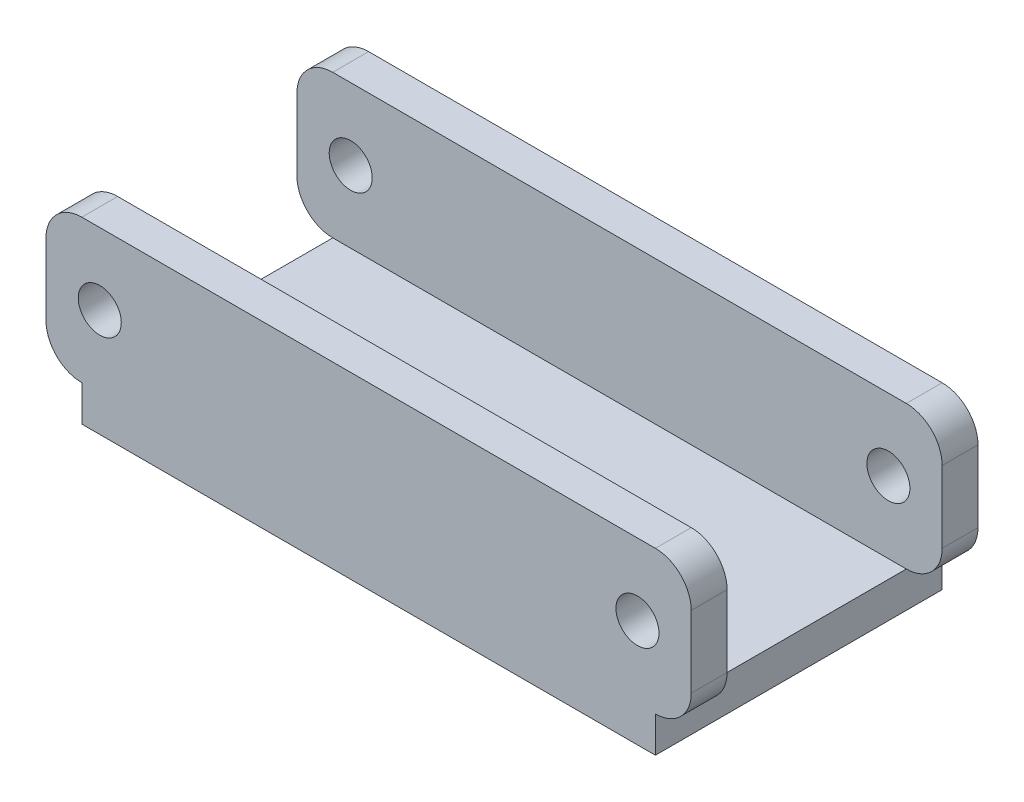
ISO-10303-21;
HEADER;
FILE_DESCRIPTION(('STEP AP214'),'2;1');
FILE_NAME('part.step','',(''),(''),'','','');
FILE_SCHEMA(('AUTOMOTIVE_DESIGN { 1 0 10303 214 1 1 1 1 }'));
ENDSEC;
DATA;
#1=APPLICATION_CONTEXT('core data for automotive mechanical design processes');
#2=APPLICATION_PROTOCOL_DEFINITION('international standard','automotive_design',2000,#1);
#3=PRODUCT_CONTEXT('',#1,'mechanical');
#4=PRODUCT('Part','Part','',(#3));
#5=PRODUCT_RELATED_PRODUCT_CATEGORY('part','',(#4));
#6=PRODUCT_DEFINITION_FORMATION('','',#4);
#7=PRODUCT_DEFINITION_CONTEXT('part definition',#1,'design');
#8=PRODUCT_DEFINITION('design','',#6,#7);
#9=PRODUCT_DEFINITION_SHAPE('','',#8);
#10=(LENGTH_UNIT() NAMED_UNIT(*) SI_UNIT(.MILLI.,.METRE.));
#11=(NAMED_UNIT(*) PLANE_ANGLE_UNIT() SI_UNIT($,.RADIAN.));
#12=(NAMED_UNIT(*) SI_UNIT($,.STERADIAN.) SOLID_ANGLE_UNIT());
#13=UNCERTAINTY_MEASURE_WITH_UNIT(LENGTH_MEASURE(1.E-05),#10,'distance_accuracy_value','');
#14=(GEOMETRIC_REPRESENTATION_CONTEXT(3) GLOBAL_UNCERTAINTY_ASSIGNED_CONTEXT((#13)) GLOBAL_UNIT_ASSIGNED_CONTEXT((#10,
#11,#12)) REPRESENTATION_CONTEXT('',''));
#15=CARTESIAN_POINT('',(0.,0.,0.));
#16=DIRECTION('',(0.,0.,1.));
#17=DIRECTION('',(1.,0.,0.));
#18=AXIS2_PLACEMENT_3D('',#15,#16,#17);
#19=CARTESIAN_POINT('',(0.,-100.,0.));
#20=DIRECTION('',(0.,-1.,0.));
#21=DIRECTION('',(0.,0.,-1.));
#22=AXIS2_PLACEMENT_3D('',#19,#20,#21);
#23=PLANE('',#22);
#24=DIRECTION('',(-1.,0.,0.));
#25=VECTOR('',#24,1.);
#26=CARTESIAN_POINT('',(-450.,-100.,50.));
#27=LINE('',#26,#25);
#28=CARTESIAN_POINT('',(400.,-100.,50.0000000000001));
#29=VERTEX_POINT('',#28);
#30=CARTESIAN_POINT('',(-400.,-100.,50.));
#31=VERTEX_POINT('',#30);
#32=EDGE_CURVE('E188',#29,#31,#27,.T.);
#33=ORIENTED_EDGE('',*,*,#32,.T.);
#34=DIRECTION('',(0.,0.,-1.));
#35=VECTOR('',#34,1.);
#36=CARTESIAN_POINT('',(-400.,-100.,400.));
#37=LINE('',#36,#35);
#38=CARTESIAN_POINT('',(-400.,-100.,350.));
#39=VERTEX_POINT('',#38);
#40=EDGE_CURVE('E216',#39,#31,#37,.T.);
#41=ORIENTED_EDGE('',*,*,#40,.F.);
#42=DIRECTION('',(1.,0.,0.));
#43=VECTOR('',#42,1.);
#44=CARTESIAN_POINT('',(-450.,-100.,350.));
#45=LINE('',#44,#43);
#46=CARTESIAN_POINT('',(400.,-100.,350.));
#47=VERTEX_POINT('',#46);
#48=EDGE_CURVE('E259',#39,#47,#45,.T.);
#49=ORIENTED_EDGE('',*,*,#48,.T.);
#50=DIRECTION('',(0.,0.,1.));
#51=VECTOR('',#50,1.);
#52=CARTESIAN_POINT('',(400.,-100.,400.));
#53=LINE('',#52,#51);
#54=EDGE_CURVE('E238',#29,#47,#53,.T.);
#55=ORIENTED_EDGE('',*,*,#54,.F.);
#56=EDGE_LOOP('',(#33,#41,#49,#55));
#57=FACE_BOUND('',#56,.T.);
#58=ADVANCED_FACE('F47',(#57),#23,.F.);
#59=CARTESIAN_POINT('',(450.,-100.,400.));
#60=DIRECTION('',(-1.,0.,0.));
#61=DIRECTION('',(0.,0.,1.));
#62=AXIS2_PLACEMENT_3D('',#59,#60,#61);
#63=PLANE('',#62);
#64=DIRECTION('',(0.,1.,0.));
#65=VECTOR('',#64,1.);
#66=CARTESIAN_POINT('',(450.,-100.,400.));
#67=LINE('',#66,#65);
#68=CARTESIAN_POINT('',(450.,-50.,400.));
#69=VERTEX_POINT('',#68);
#70=CARTESIAN_POINT('',(450.,50.,400.));
#71=VERTEX_POINT('',#70);
#72=EDGE_CURVE('E262',#69,#71,#67,.T.);
#73=ORIENTED_EDGE('',*,*,#72,.F.);
#74=DIRECTION('',(0.,0.,-1.));
#75=VECTOR('',#74,1.);
#76=CARTESIAN_POINT('',(450.,-50.,400.));
#77=LINE('',#76,#75);
#78=CARTESIAN_POINT('',(450.,-50.,350.));
#79=VERTEX_POINT('',#78);
#80=EDGE_CURVE('E11',#69,#79,#77,.T.);
#81=ORIENTED_EDGE('',*,*,#80,.T.);
#82=DIRECTION('',(0.,1.,0.));
#83=VECTOR('',#82,1.);
#84=CARTESIAN_POINT('',(450.,-100.,350.));
#85=LINE('',#84,#83);
#86=CARTESIAN_POINT('',(450.,50.,350.));
#87=VERTEX_POINT('',#86);
#88=EDGE_CURVE('E272',#79,#87,#85,.T.);
#89=ORIENTED_EDGE('',*,*,#88,.T.);
#90=DIRECTION('',(0.,0.,-1.));
#91=VECTOR('',#90,1.);
#92=CARTESIAN_POINT('',(450.,50.,400.));
#93=LINE('',#92,#91);
#94=EDGE_CURVE('E56',#87,#71,#93,.F.);
#95=ORIENTED_EDGE('',*,*,#94,.T.);
#96=EDGE_LOOP('',(#73,#81,#89,#95));
#97=FACE_BOUND('',#96,.T.);
#98=ADVANCED_FACE('F335',(#97),#63,.F.);
#99=CARTESIAN_POINT('',(-450.,100.,400.));
#100=DIRECTION('',(0.,-1.,0.));
#101=DIRECTION('',(0.,0.,-1.));
#102=AXIS2_PLACEMENT_3D('',#99,#100,#101);
#103=PLANE('',#102);
#104=DIRECTION('',(1.,0.,0.));
#105=VECTOR('',#104,1.);
#106=CARTESIAN_POINT('',(-848.527394625038,100.,350.));
#107=LINE('',#106,#105);
#108=CARTESIAN_POINT('',(-400.,100.,350.));
#109=VERTEX_POINT('',#108);
#110=CARTESIAN_POINT('',(400.,100.,350.));
#111=VERTEX_POINT('',#110);
#112=EDGE_CURVE('E267',#109,#111,#107,.T.);
#113=ORIENTED_EDGE('',*,*,#112,.F.);
#114=DIRECTION('',(0.,0.,-1.));
#115=VECTOR('',#114,1.);
#116=CARTESIAN_POINT('',(-400.,100.,400.));
#117=LINE('',#116,#115);
#118=CARTESIAN_POINT('',(-400.,100.,400.));
#119=VERTEX_POINT('',#118);
#120=EDGE_CURVE('E72',#109,#119,#117,.F.);
#121=ORIENTED_EDGE('',*,*,#120,.T.);
#122=DIRECTION('',(-1.,0.,0.));
#123=VECTOR('',#122,1.);
#124=CARTESIAN_POINT('',(-450.,100.,400.));
#125=LINE('',#124,#123);
#126=CARTESIAN_POINT('',(400.,100.,400.));
#127=VERTEX_POINT('',#126);
#128=EDGE_CURVE('E268',#127,#119,#125,.T.);
#129=ORIENTED_EDGE('',*,*,#128,.F.);
#130=DIRECTION('',(0.,0.,-1.));
#131=VECTOR('',#130,1.);
#132=CARTESIAN_POINT('',(400.,100.,400.));
#133=LINE('',#132,#131);
#134=EDGE_CURVE('E307',#127,#111,#133,.T.);
#135=ORIENTED_EDGE('',*,*,#134,.T.);
#136=EDGE_LOOP('',(#113,#121,#129,#135));
#137=FACE_BOUND('',#136,.T.);
#138=ADVANCED_FACE('F342',(#137),#103,.F.);
#139=CARTESIAN_POINT('',(-450.,-100.,400.));
#140=DIRECTION('',(1.,0.,0.));
#141=DIRECTION('',(0.,0.,-1.));
#142=AXIS2_PLACEMENT_3D('',#139,#140,#141);
#143=PLANE('',#142);
#144=DIRECTION('',(0.,-1.,0.));
#145=VECTOR('',#144,1.);
#146=CARTESIAN_POINT('',(-450.,-100.,350.));
#147=LINE('',#146,#145);
#148=CARTESIAN_POINT('',(-450.,50.,350.));
#149=VERTEX_POINT('',#148);
#150=CARTESIAN_POINT('',(-450.,-50.,350.));
#151=VERTEX_POINT('',#150);
#152=EDGE_CURVE('E263',#149,#151,#147,.T.);
#153=ORIENTED_EDGE('',*,*,#152,.T.);
#154=DIRECTION('',(0.,0.,-1.));
#155=VECTOR('',#154,1.);
#156=CARTESIAN_POINT('',(-450.,-50.,400.));
#157=LINE('',#156,#155);
#158=CARTESIAN_POINT('',(-450.,-50.,400.));
#159=VERTEX_POINT('',#158);
#160=EDGE_CURVE('E297',#151,#159,#157,.F.);
#161=ORIENTED_EDGE('',*,*,#160,.T.);
#162=DIRECTION('',(0.,-1.,0.));
#163=VECTOR('',#162,1.);
#164=CARTESIAN_POINT('',(-450.,-100.,400.));
#165=LINE('',#164,#163);
#166=CARTESIAN_POINT('',(-450.,50.,400.));
#167=VERTEX_POINT('',#166);
#168=EDGE_CURVE('E264',#167,#159,#165,.T.);
#169=ORIENTED_EDGE('',*,*,#168,.F.);
#170=DIRECTION('',(0.,0.,-1.));
#171=VECTOR('',#170,1.);
#172=CARTESIAN_POINT('',(-450.,50.,400.));
#173=LINE('',#172,#171);
#174=EDGE_CURVE('E294',#167,#149,#173,.T.);
#175=ORIENTED_EDGE('',*,*,#174,.T.);
#176=EDGE_LOOP('',(#153,#161,#169,#175));
#177=FACE_BOUND('',#176,.T.);
#178=ADVANCED_FACE('F580',(#177),#143,.F.);
#179=CARTESIAN_POINT('',(0.,0.,400.));
#180=DIRECTION('',(0.,0.,-1.));
#181=DIRECTION('',(-1.,0.,0.));
#182=AXIS2_PLACEMENT_3D('',#179,#180,#181);
#183=PLANE('',#182);
#184=CARTESIAN_POINT('',(-375.,0.,400.));
#185=DIRECTION('',(0.,0.,1.));
#186=DIRECTION('',(1.,0.,0.));
#187=AXIS2_PLACEMENT_3D('',#184,#185,#186);
#188=CIRCLE('',#187,30.);
#189=CARTESIAN_POINT('',(-345.,0.,400.));
#190=VERTEX_POINT('',#189);
#191=EDGE_CURVE('E253',#190,#190,#188,.T.);
#192=ORIENTED_EDGE('',*,*,#191,.F.);
#193=EDGE_LOOP('',(#192));
#194=FACE_BOUND('',#193,.T.);
#195=CARTESIAN_POINT('',(375.,0.,400.));
#196=DIRECTION('',(0.,0.,1.));
#197=DIRECTION('',(1.,0.,0.));
#198=AXIS2_PLACEMENT_3D('',#195,#196,#197);
#199=CIRCLE('',#198,30.);
#200=CARTESIAN_POINT('',(405.,0.,400.));
#201=VERTEX_POINT('',#200);
#202=EDGE_CURVE('E252',#201,#201,#199,.T.);
#203=ORIENTED_EDGE('',*,*,#202,.F.);
#204=EDGE_LOOP('',(#203));
#205=FACE_BOUND('',#204,.T.);
#206=ORIENTED_EDGE('',*,*,#168,.T.);
#207=CARTESIAN_POINT('',(-400.,-50.,400.));
#208=DIRECTION('',(0.,0.,-1.));
#209=DIRECTION('',(-1.,0.,0.));
#210=AXIS2_PLACEMENT_3D('',#207,#208,#209);
#211=CIRCLE('',#210,50.);
#212=CARTESIAN_POINT('',(-400.,-100.,400.));
#213=VERTEX_POINT('',#212);
#214=EDGE_CURVE('E305',#159,#213,#211,.F.);
#215=ORIENTED_EDGE('',*,*,#214,.T.);
#216=DIRECTION('',(0.,1.,0.));
#217=VECTOR('',#216,1.);
#218=CARTESIAN_POINT('',(-400.,-150.,400.));
#219=LINE('',#218,#217);
#220=CARTESIAN_POINT('',(-400.,-150.,400.));
#221=VERTEX_POINT('',#220);
#222=EDGE_CURVE('E235',#221,#213,#219,.T.);
#223=ORIENTED_EDGE('',*,*,#222,.F.);
#224=DIRECTION('',(-1.,0.,0.));
#225=VECTOR('',#224,1.);
#226=CARTESIAN_POINT('',(-400.,-150.,400.));
#227=LINE('',#226,#225);
#228=CARTESIAN_POINT('',(400.,-150.,400.));
#229=VERTEX_POINT('',#228);
#230=EDGE_CURVE('E233',#229,#221,#227,.T.);
#231=ORIENTED_EDGE('',*,*,#230,.F.);
#232=DIRECTION('',(0.,1.,0.));
#233=VECTOR('',#232,1.);
#234=CARTESIAN_POINT('',(400.,-150.,400.));
#235=LINE('',#234,#233);
#236=CARTESIAN_POINT('',(400.,-100.,400.));
#237=VERTEX_POINT('',#236);
#238=EDGE_CURVE('E243',#229,#237,#235,.T.);
#239=ORIENTED_EDGE('',*,*,#238,.T.);
#240=CARTESIAN_POINT('',(400.,-50.,400.));
#241=DIRECTION('',(0.,0.,-1.));
#242=DIRECTION('',(-1.,0.,0.));
#243=AXIS2_PLACEMENT_3D('',#240,#241,#242);
#244=CIRCLE('',#243,50.);
#245=EDGE_CURVE('E301',#237,#69,#244,.F.);
#246=ORIENTED_EDGE('',*,*,#245,.T.);
#247=ORIENTED_EDGE('',*,*,#72,.T.);
#248=CARTESIAN_POINT('',(400.,50.,400.));
#249=DIRECTION('',(0.,0.,-1.));
#250=DIRECTION('',(-1.,0.,0.));
#251=AXIS2_PLACEMENT_3D('',#248,#249,#250);
#252=CIRCLE('',#251,50.);
#253=EDGE_CURVE('E299',#71,#127,#252,.F.);
#254=ORIENTED_EDGE('',*,*,#253,.T.);
#255=ORIENTED_EDGE('',*,*,#128,.T.);
#256=CARTESIAN_POINT('',(-400.,50.,400.));
#257=DIRECTION('',(0.,0.,-1.));
#258=DIRECTION('',(-1.,0.,0.));
#259=AXIS2_PLACEMENT_3D('',#256,#257,#258);
#260=CIRCLE('',#259,50.);
#261=EDGE_CURVE('E303',#119,#167,#260,.F.);
#262=ORIENTED_EDGE('',*,*,#261,.T.);
#263=EDGE_LOOP('',(#206,#215,#223,#231,#239,#246,#247,#254,#255,#262));
#264=FACE_BOUND('',#263,.T.);
#265=ADVANCED_FACE('F573',(#194,#205,#264),#183,.F.);
#266=CARTESIAN_POINT('',(-848.527394625038,-300.,350.));
#267=DIRECTION('',(0.,0.,1.));
#268=DIRECTION('',(1.,0.,0.));
#269=AXIS2_PLACEMENT_3D('',#266,#267,#268);
#270=PLANE('',#269);
#271=CARTESIAN_POINT('',(-375.,0.,350.));
#272=DIRECTION('',(0.,0.,1.));
#273=DIRECTION('',(1.,0.,0.));
#274=AXIS2_PLACEMENT_3D('',#271,#272,#273);
#275=CIRCLE('',#274,30.);
#276=CARTESIAN_POINT('',(-345.,0.,350.));
#277=VERTEX_POINT('',#276);
#278=EDGE_CURVE('E51',#277,#277,#275,.T.);
#279=ORIENTED_EDGE('',*,*,#278,.T.);
#280=EDGE_LOOP('',(#279));
#281=FACE_BOUND('',#280,.T.);
#282=CARTESIAN_POINT('',(375.,0.,350.));
#283=DIRECTION('',(0.,0.,1.));
#284=DIRECTION('',(1.,0.,0.));
#285=AXIS2_PLACEMENT_3D('',#282,#283,#284);
#286=CIRCLE('',#285,30.);
#287=CARTESIAN_POINT('',(405.,0.,350.));
#288=VERTEX_POINT('',#287);
#289=EDGE_CURVE('E256',#288,#288,#286,.T.);
#290=ORIENTED_EDGE('',*,*,#289,.T.);
#291=EDGE_LOOP('',(#290));
#292=FACE_BOUND('',#291,.T.);
#293=ORIENTED_EDGE('',*,*,#48,.F.);
#294=CARTESIAN_POINT('',(-400.,-50.,350.));
#295=DIRECTION('',(0.,0.,1.));
#296=DIRECTION('',(1.,0.,0.));
#297=AXIS2_PLACEMENT_3D('',#294,#295,#296);
#298=CIRCLE('',#297,50.);
#299=EDGE_CURVE('E292',#39,#151,#298,.F.);
#300=ORIENTED_EDGE('',*,*,#299,.T.);
#301=ORIENTED_EDGE('',*,*,#152,.F.);
#302=CARTESIAN_POINT('',(-400.,50.,350.));
#303=DIRECTION('',(0.,0.,1.));
#304=DIRECTION('',(1.,0.,0.));
#305=AXIS2_PLACEMENT_3D('',#302,#303,#304);
#306=CIRCLE('',#305,50.);
#307=EDGE_CURVE('E290',#149,#109,#306,.F.);
#308=ORIENTED_EDGE('',*,*,#307,.T.);
#309=ORIENTED_EDGE('',*,*,#112,.T.);
#310=CARTESIAN_POINT('',(400.,50.,350.));
#311=DIRECTION('',(0.,0.,1.));
#312=DIRECTION('',(1.,0.,0.));
#313=AXIS2_PLACEMENT_3D('',#310,#311,#312);
#314=CIRCLE('',#313,50.);
#315=EDGE_CURVE('E285',#111,#87,#314,.F.);
#316=ORIENTED_EDGE('',*,*,#315,.T.);
#317=ORIENTED_EDGE('',*,*,#88,.F.);
#318=CARTESIAN_POINT('',(400.,-50.,350.));
#319=DIRECTION('',(0.,0.,1.));
#320=DIRECTION('',(1.,0.,0.));
#321=AXIS2_PLACEMENT_3D('',#318,#319,#320);
#322=CIRCLE('',#321,50.);
#323=EDGE_CURVE('E287',#79,#47,#322,.F.);
#324=ORIENTED_EDGE('',*,*,#323,.T.);
#325=EDGE_LOOP('',(#293,#300,#301,#308,#309,#316,#317,#324));
#326=FACE_BOUND('',#325,.T.);
#327=ADVANCED_FACE('F317',(#281,#292,#326),#270,.F.);
#328=CARTESIAN_POINT('',(-400.,-50.,400.));
#329=DIRECTION('',(0.,0.,-1.));
#330=DIRECTION('',(-1.,0.,0.));
#331=AXIS2_PLACEMENT_3D('',#328,#329,#330);
#332=CYLINDRICAL_SURFACE('',#331,50.);
#333=ORIENTED_EDGE('',*,*,#214,.F.);
#334=ORIENTED_EDGE('',*,*,#160,.F.);
#335=ORIENTED_EDGE('',*,*,#299,.F.);
#336=DIRECTION('',(0.,0.,-1.));
#337=VECTOR('',#336,1.);
#338=CARTESIAN_POINT('',(-400.,-100.,400.));
#339=LINE('',#338,#337);
#340=EDGE_CURVE('E282',#213,#39,#339,.T.);
#341=ORIENTED_EDGE('',*,*,#340,.F.);
#342=EDGE_LOOP('',(#333,#334,#335,#341));
#343=FACE_BOUND('',#342,.T.);
#344=ADVANCED_FACE('F556',(#343),#332,.T.);
#345=CARTESIAN_POINT('',(-400.,50.,400.));
#346=DIRECTION('',(0.,0.,-1.));
#347=DIRECTION('',(-1.,0.,0.));
#348=AXIS2_PLACEMENT_3D('',#345,#346,#347);
#349=CYLINDRICAL_SURFACE('',#348,50.);
#350=ORIENTED_EDGE('',*,*,#261,.F.);
#351=ORIENTED_EDGE('',*,*,#120,.F.);
#352=ORIENTED_EDGE('',*,*,#307,.F.);
#353=ORIENTED_EDGE('',*,*,#174,.F.);
#354=EDGE_LOOP('',(#350,#351,#352,#353));
#355=FACE_BOUND('',#354,.T.);
#356=ADVANCED_FACE('F548',(#355),#349,.T.);
#357=CARTESIAN_POINT('',(400.,-50.,400.));
#358=DIRECTION('',(0.,0.,-1.));
#359=DIRECTION('',(-1.,0.,0.));
#360=AXIS2_PLACEMENT_3D('',#357,#358,#359);
#361=CYLINDRICAL_SURFACE('',#360,50.);
#362=ORIENTED_EDGE('',*,*,#245,.F.);
#363=DIRECTION('',(0.,0.,-1.));
#364=VECTOR('',#363,1.);
#365=CARTESIAN_POINT('',(400.,-100.,400.));
#366=LINE('',#365,#364);
#367=EDGE_CURVE('E279',#47,#237,#366,.F.);
#368=ORIENTED_EDGE('',*,*,#367,.F.);
#369=ORIENTED_EDGE('',*,*,#323,.F.);
#370=ORIENTED_EDGE('',*,*,#80,.F.);
#371=EDGE_LOOP('',(#362,#368,#369,#370));
#372=FACE_BOUND('',#371,.T.);
#373=ADVANCED_FACE('F540',(#372),#361,.T.);
#374=CARTESIAN_POINT('',(400.,50.,400.));
#375=DIRECTION('',(0.,0.,-1.));
#376=DIRECTION('',(-1.,0.,0.));
#377=AXIS2_PLACEMENT_3D('',#374,#375,#376);
#378=CYLINDRICAL_SURFACE('',#377,50.);
#379=ORIENTED_EDGE('',*,*,#253,.F.);
#380=ORIENTED_EDGE('',*,*,#94,.F.);
#381=ORIENTED_EDGE('',*,*,#315,.F.);
#382=ORIENTED_EDGE('',*,*,#134,.F.);
#383=EDGE_LOOP('',(#379,#380,#381,#382));
#384=FACE_BOUND('',#383,.T.);
#385=ADVANCED_FACE('F49',(#384),#378,.T.);
#386=CARTESIAN_POINT('',(375.,0.,0.));
#387=DIRECTION('',(0.,0.,1.));
#388=DIRECTION('',(1.,0.,0.));
#389=AXIS2_PLACEMENT_3D('',#386,#387,#388);
#390=CYLINDRICAL_SURFACE('',#389,30.);
#391=ORIENTED_EDGE('',*,*,#202,.T.);
#392=EDGE_LOOP('',(#391));
#393=FACE_BOUND('',#392,.T.);
#394=ORIENTED_EDGE('',*,*,#289,.F.);
#395=EDGE_LOOP('',(#394));
#396=FACE_BOUND('',#395,.T.);
#397=ADVANCED_FACE('F322',(#393,#396),#390,.F.);
#398=CARTESIAN_POINT('',(-375.,0.,0.));
#399=DIRECTION('',(0.,0.,1.));
#400=DIRECTION('',(1.,0.,0.));
#401=AXIS2_PLACEMENT_3D('',#398,#399,#400);
#402=CYLINDRICAL_SURFACE('',#401,30.);
#403=ORIENTED_EDGE('',*,*,#191,.T.);
#404=EDGE_LOOP('',(#403));
#405=FACE_BOUND('',#404,.T.);
#406=ORIENTED_EDGE('',*,*,#278,.F.);
#407=EDGE_LOOP('',(#406));
#408=FACE_BOUND('',#407,.T.);
#409=ADVANCED_FACE('F319',(#405,#408),#402,.F.);
#410=CARTESIAN_POINT('',(-400.,-150.,400.));
#411=DIRECTION('',(1.,0.,0.));
#412=DIRECTION('',(0.,0.,-1.));
#413=AXIS2_PLACEMENT_3D('',#410,#411,#412);
#414=PLANE('',#413);
#415=ORIENTED_EDGE('',*,*,#340,.T.);
#416=ORIENTED_EDGE('',*,*,#40,.T.);
#417=DIRECTION('',(0.,0.,-1.));
#418=VECTOR('',#417,1.);
#419=CARTESIAN_POINT('',(-400.,-100.,400.));
#420=LINE('',#419,#418);
#421=CARTESIAN_POINT('',(-400.,-100.,0.));
#422=VERTEX_POINT('',#421);
#423=EDGE_CURVE('E390',#31,#422,#420,.T.);
#424=ORIENTED_EDGE('',*,*,#423,.T.);
#425=DIRECTION('',(0.,1.,0.));
#426=VECTOR('',#425,1.);
#427=CARTESIAN_POINT('',(-400.,-150.,0.));
#428=LINE('',#427,#426);
#429=CARTESIAN_POINT('',(-400.,-150.,0.));
#430=VERTEX_POINT('',#429);
#431=EDGE_CURVE('E249',#430,#422,#428,.T.);
#432=ORIENTED_EDGE('',*,*,#431,.F.);
#433=DIRECTION('',(0.,0.,-1.));
#434=VECTOR('',#433,1.);
#435=CARTESIAN_POINT('',(-400.,-150.,400.));
#436=LINE('',#435,#434);
#437=EDGE_CURVE('E225',#221,#430,#436,.T.);
#438=ORIENTED_EDGE('',*,*,#437,.F.);
#439=ORIENTED_EDGE('',*,*,#222,.T.);
#440=EDGE_LOOP('',(#415,#416,#424,#432,#438,#439));
#441=FACE_BOUND('',#440,.T.);
#442=ADVANCED_FACE('F321',(#441),#414,.F.);
#443=CARTESIAN_POINT('',(-400.,-150.,0.));
#444=DIRECTION('',(0.,0.,1.));
#445=DIRECTION('',(1.,0.,0.));
#446=AXIS2_PLACEMENT_3D('',#443,#444,#445);
#447=PLANE('',#446);
#448=ORIENTED_EDGE('',*,*,#431,.T.);
#449=CARTESIAN_POINT('',(-400.,-50.,0.));
#450=DIRECTION('',(0.,0.,-1.));
#451=DIRECTION('',(-1.,0.,0.));
#452=AXIS2_PLACEMENT_3D('',#449,#450,#451);
#453=CIRCLE('',#452,50.);
#454=CARTESIAN_POINT('',(-450.,-50.,0.));
#455=VERTEX_POINT('',#454);
#456=EDGE_CURVE('E384',#422,#455,#453,.T.);
#457=ORIENTED_EDGE('',*,*,#456,.T.);
#458=DIRECTION('',(0.,-1.,0.));
#459=VECTOR('',#458,1.);
#460=CARTESIAN_POINT('',(-450.,-100.,0.));
#461=LINE('',#460,#459);
#462=CARTESIAN_POINT('',(-450.,50.,0.));
#463=VERTEX_POINT('',#462);
#464=EDGE_CURVE('E377',#463,#455,#461,.T.);
#465=ORIENTED_EDGE('',*,*,#464,.F.);
#466=CARTESIAN_POINT('',(-400.,50.,0.));
#467=DIRECTION('',(0.,0.,-1.));
#468=DIRECTION('',(-1.,0.,0.));
#469=AXIS2_PLACEMENT_3D('',#466,#467,#468);
#470=CIRCLE('',#469,50.);
#471=CARTESIAN_POINT('',(-400.,100.,0.));
#472=VERTEX_POINT('',#471);
#473=EDGE_CURVE('E382',#463,#472,#470,.T.);
#474=ORIENTED_EDGE('',*,*,#473,.T.);
#475=DIRECTION('',(-1.,0.,0.));
#476=VECTOR('',#475,1.);
#477=CARTESIAN_POINT('',(-450.,100.,0.));
#478=LINE('',#477,#476);
#479=CARTESIAN_POINT('',(400.,100.,0.));
#480=VERTEX_POINT('',#479);
#481=EDGE_CURVE('E374',#480,#472,#478,.T.);
#482=ORIENTED_EDGE('',*,*,#481,.F.);
#483=CARTESIAN_POINT('',(400.,50.,0.));
#484=DIRECTION('',(0.,0.,-1.));
#485=DIRECTION('',(-1.,0.,0.));
#486=AXIS2_PLACEMENT_3D('',#483,#484,#485);
#487=CIRCLE('',#486,50.);
#488=CARTESIAN_POINT('',(450.,50.,0.));
#489=VERTEX_POINT('',#488);
#490=EDGE_CURVE('E386',#480,#489,#487,.T.);
#491=ORIENTED_EDGE('',*,*,#490,.T.);
#492=DIRECTION('',(0.,1.,0.));
#493=VECTOR('',#492,1.);
#494=CARTESIAN_POINT('',(450.,-100.,0.));
#495=LINE('',#494,#493);
#496=CARTESIAN_POINT('',(450.,-50.,0.));
#497=VERTEX_POINT('',#496);
#498=EDGE_CURVE('E184',#497,#489,#495,.T.);
#499=ORIENTED_EDGE('',*,*,#498,.F.);
#500=CARTESIAN_POINT('',(400.,-50.,0.));
#501=DIRECTION('',(0.,0.,-1.));
#502=DIRECTION('',(-1.,0.,0.));
#503=AXIS2_PLACEMENT_3D('',#500,#501,#502);
#504=CIRCLE('',#503,50.);
#505=CARTESIAN_POINT('',(400.,-100.,0.));
#506=VERTEX_POINT('',#505);
#507=EDGE_CURVE('E388',#497,#506,#504,.T.);
#508=ORIENTED_EDGE('',*,*,#507,.T.);
#509=DIRECTION('',(0.,1.,0.));
#510=VECTOR('',#509,1.);
#511=CARTESIAN_POINT('',(400.,-150.,0.));
#512=LINE('',#511,#510);
#513=CARTESIAN_POINT('',(400.,-150.,0.));
#514=VERTEX_POINT('',#513);
#515=EDGE_CURVE('E246',#514,#506,#512,.T.);
#516=ORIENTED_EDGE('',*,*,#515,.F.);
#517=DIRECTION('',(1.,0.,0.));
#518=VECTOR('',#517,1.);
#519=CARTESIAN_POINT('',(-400.,-150.,0.));
#520=LINE('',#519,#518);
#521=EDGE_CURVE('E228',#430,#514,#520,.T.);
#522=ORIENTED_EDGE('',*,*,#521,.F.);
#523=EDGE_LOOP('',(#448,#457,#465,#474,#482,#491,#499,#508,#516,#522));
#524=FACE_BOUND('',#523,.T.);
#525=CARTESIAN_POINT('',(-375.,0.,0.));
#526=DIRECTION('',(0.,0.,1.));
#527=DIRECTION('',(1.,0.,0.));
#528=AXIS2_PLACEMENT_3D('',#525,#526,#527);
#529=CIRCLE('',#528,30.);
#530=CARTESIAN_POINT('',(-345.,0.,0.));
#531=VERTEX_POINT('',#530);
#532=EDGE_CURVE('E221',#531,#531,#529,.T.);
#533=ORIENTED_EDGE('',*,*,#532,.T.);
#534=EDGE_LOOP('',(#533));
#535=FACE_BOUND('',#534,.T.);
#536=CARTESIAN_POINT('',(375.,0.,0.));
#537=DIRECTION('',(0.,0.,1.));
#538=DIRECTION('',(1.,0.,0.));
#539=AXIS2_PLACEMENT_3D('',#536,#537,#538);
#540=CIRCLE('',#539,30.);
#541=CARTESIAN_POINT('',(405.,0.,0.));
#542=VERTEX_POINT('',#541);
#543=EDGE_CURVE('E365',#542,#542,#540,.T.);
#544=ORIENTED_EDGE('',*,*,#543,.T.);
#545=EDGE_LOOP('',(#544));
#546=FACE_BOUND('',#545,.T.);
#547=ADVANCED_FACE('F330',(#524,#535,#546),#447,.F.);
#548=CARTESIAN_POINT('',(400.,-150.,400.));
#549=DIRECTION('',(-1.,0.,0.));
#550=DIRECTION('',(0.,0.,1.));
#551=AXIS2_PLACEMENT_3D('',#548,#549,#550);
#552=PLANE('',#551);
#553=EDGE_CURVE('E229',#506,#29,#53,.T.);
#554=ORIENTED_EDGE('',*,*,#553,.T.);
#555=ORIENTED_EDGE('',*,*,#54,.T.);
#556=ORIENTED_EDGE('',*,*,#367,.T.);
#557=ORIENTED_EDGE('',*,*,#238,.F.);
#558=DIRECTION('',(0.,0.,1.));
#559=VECTOR('',#558,1.);
#560=CARTESIAN_POINT('',(400.,-150.,400.));
#561=LINE('',#560,#559);
#562=EDGE_CURVE('E231',#514,#229,#561,.T.);
#563=ORIENTED_EDGE('',*,*,#562,.F.);
#564=ORIENTED_EDGE('',*,*,#515,.T.);
#565=EDGE_LOOP('',(#554,#555,#556,#557,#563,#564));
#566=FACE_BOUND('',#565,.T.);
#567=ADVANCED_FACE('F350',(#566),#552,.F.);
#568=CARTESIAN_POINT('',(0.,-150.,0.));
#569=DIRECTION('',(0.,-1.,0.));
#570=DIRECTION('',(0.,0.,-1.));
#571=AXIS2_PLACEMENT_3D('',#568,#569,#570);
#572=PLANE('',#571);
#573=ORIENTED_EDGE('',*,*,#437,.T.);
#574=ORIENTED_EDGE('',*,*,#521,.T.);
#575=ORIENTED_EDGE('',*,*,#562,.T.);
#576=ORIENTED_EDGE('',*,*,#230,.T.);
#577=EDGE_LOOP('',(#573,#574,#575,#576));
#578=FACE_BOUND('',#577,.T.);
#579=ADVANCED_FACE('F348',(#578),#572,.T.);
#580=CARTESIAN_POINT('',(-450.,-100.,400.));
#581=DIRECTION('',(1.,0.,0.));
#582=DIRECTION('',(0.,0.,-1.));
#583=AXIS2_PLACEMENT_3D('',#580,#581,#582);
#584=PLANE('',#583);
#585=ORIENTED_EDGE('',*,*,#464,.T.);
#586=DIRECTION('',(0.,0.,-1.));
#587=VECTOR('',#586,1.);
#588=CARTESIAN_POINT('',(-450.,-50.,400.));
#589=LINE('',#588,#587);
#590=CARTESIAN_POINT('',(-450.,-50.,50.));
#591=VERTEX_POINT('',#590);
#592=EDGE_CURVE('E214',#455,#591,#589,.F.);
#593=ORIENTED_EDGE('',*,*,#592,.T.);
#594=DIRECTION('',(0.,1.,0.));
#595=VECTOR('',#594,1.);
#596=CARTESIAN_POINT('',(-450.,-100.,50.));
#597=LINE('',#596,#595);
#598=CARTESIAN_POINT('',(-450.,50.,50.));
#599=VERTEX_POINT('',#598);
#600=EDGE_CURVE('E195',#591,#599,#597,.T.);
#601=ORIENTED_EDGE('',*,*,#600,.T.);
#602=DIRECTION('',(0.,0.,-1.));
#603=VECTOR('',#602,1.);
#604=CARTESIAN_POINT('',(-450.,50.,400.));
#605=LINE('',#604,#603);
#606=EDGE_CURVE('E211',#599,#463,#605,.T.);
#607=ORIENTED_EDGE('',*,*,#606,.T.);
#608=EDGE_LOOP('',(#585,#593,#601,#607));
#609=FACE_BOUND('',#608,.T.);
#610=ADVANCED_FACE('F399',(#609),#584,.F.);
#611=CARTESIAN_POINT('',(-450.,100.,400.));
#612=DIRECTION('',(0.,-1.,0.));
#613=DIRECTION('',(0.,0.,-1.));
#614=AXIS2_PLACEMENT_3D('',#611,#612,#613);
#615=PLANE('',#614);
#616=DIRECTION('',(-1.,0.,0.));
#617=VECTOR('',#616,1.);
#618=CARTESIAN_POINT('',(-848.527394625038,100.,50.));
#619=LINE('',#618,#617);
#620=CARTESIAN_POINT('',(400.,100.,50.));
#621=VERTEX_POINT('',#620);
#622=CARTESIAN_POINT('',(-400.,100.,50.));
#623=VERTEX_POINT('',#622);
#624=EDGE_CURVE('E224',#621,#623,#619,.T.);
#625=ORIENTED_EDGE('',*,*,#624,.F.);
#626=DIRECTION('',(0.,0.,-1.));
#627=VECTOR('',#626,1.);
#628=CARTESIAN_POINT('',(400.,100.,400.));
#629=LINE('',#628,#627);
#630=EDGE_CURVE('E200',#621,#480,#629,.T.);
#631=ORIENTED_EDGE('',*,*,#630,.T.);
#632=ORIENTED_EDGE('',*,*,#481,.T.);
#633=DIRECTION('',(0.,0.,-1.));
#634=VECTOR('',#633,1.);
#635=CARTESIAN_POINT('',(-400.,100.,400.));
#636=LINE('',#635,#634);
#637=EDGE_CURVE('E203',#472,#623,#636,.F.);
#638=ORIENTED_EDGE('',*,*,#637,.T.);
#639=EDGE_LOOP('',(#625,#631,#632,#638));
#640=FACE_BOUND('',#639,.T.);
#641=ADVANCED_FACE('F405',(#640),#615,.F.);
#642=CARTESIAN_POINT('',(450.,-100.,400.));
#643=DIRECTION('',(-1.,0.,0.));
#644=DIRECTION('',(0.,0.,1.));
#645=AXIS2_PLACEMENT_3D('',#642,#643,#644);
#646=PLANE('',#645);
#647=DIRECTION('',(0.,-1.,0.));
#648=VECTOR('',#647,1.);
#649=CARTESIAN_POINT('',(450.,-100.,50.));
#650=LINE('',#649,#648);
#651=CARTESIAN_POINT('',(450.,50.,50.));
#652=VERTEX_POINT('',#651);
#653=CARTESIAN_POINT('',(450.,-50.,50.));
#654=VERTEX_POINT('',#653);
#655=EDGE_CURVE('E182',#652,#654,#650,.T.);
#656=ORIENTED_EDGE('',*,*,#655,.T.);
#657=DIRECTION('',(0.,0.,-1.));
#658=VECTOR('',#657,1.);
#659=CARTESIAN_POINT('',(450.,-50.,400.));
#660=LINE('',#659,#658);
#661=EDGE_CURVE('E187',#654,#497,#660,.T.);
#662=ORIENTED_EDGE('',*,*,#661,.T.);
#663=ORIENTED_EDGE('',*,*,#498,.T.);
#664=DIRECTION('',(0.,0.,-1.));
#665=VECTOR('',#664,1.);
#666=CARTESIAN_POINT('',(450.,50.,400.));
#667=LINE('',#666,#665);
#668=EDGE_CURVE('E178',#489,#652,#667,.F.);
#669=ORIENTED_EDGE('',*,*,#668,.T.);
#670=EDGE_LOOP('',(#656,#662,#663,#669));
#671=FACE_BOUND('',#670,.T.);
#672=ADVANCED_FACE('F180',(#671),#646,.F.);
#673=CARTESIAN_POINT('',(-848.527394625038,-300.,50.));
#674=DIRECTION('',(0.,0.,-1.));
#675=DIRECTION('',(-1.,0.,0.));
#676=AXIS2_PLACEMENT_3D('',#673,#674,#675);
#677=PLANE('',#676);
#678=CARTESIAN_POINT('',(-375.,0.,50.));
#679=DIRECTION('',(0.,0.,-1.));
#680=DIRECTION('',(-1.,0.,0.));
#681=AXIS2_PLACEMENT_3D('',#678,#679,#680);
#682=CIRCLE('',#681,30.);
#683=CARTESIAN_POINT('',(-405.,0.,50.));
#684=VERTEX_POINT('',#683);
#685=EDGE_CURVE('E220',#684,#684,#682,.T.);
#686=ORIENTED_EDGE('',*,*,#685,.T.);
#687=EDGE_LOOP('',(#686));
#688=FACE_BOUND('',#687,.T.);
#689=CARTESIAN_POINT('',(375.,0.,50.));
#690=DIRECTION('',(0.,0.,-1.));
#691=DIRECTION('',(-1.,0.,0.));
#692=AXIS2_PLACEMENT_3D('',#689,#690,#691);
#693=CIRCLE('',#692,30.);
#694=CARTESIAN_POINT('',(345.,0.,50.));
#695=VERTEX_POINT('',#694);
#696=EDGE_CURVE('E217',#695,#695,#693,.T.);
#697=ORIENTED_EDGE('',*,*,#696,.T.);
#698=EDGE_LOOP('',(#697));
#699=FACE_BOUND('',#698,.T.);
#700=ORIENTED_EDGE('',*,*,#32,.F.);
#701=CARTESIAN_POINT('',(400.,-50.,50.));
#702=DIRECTION('',(0.,0.,-1.));
#703=DIRECTION('',(-1.,0.,0.));
#704=AXIS2_PLACEMENT_3D('',#701,#702,#703);
#705=CIRCLE('',#704,50.);
#706=EDGE_CURVE('E64',#29,#654,#705,.F.);
#707=ORIENTED_EDGE('',*,*,#706,.T.);
#708=ORIENTED_EDGE('',*,*,#655,.F.);
#709=CARTESIAN_POINT('',(400.,50.,50.));
#710=DIRECTION('',(0.,0.,-1.));
#711=DIRECTION('',(-1.,0.,0.));
#712=AXIS2_PLACEMENT_3D('',#709,#710,#711);
#713=CIRCLE('',#712,50.);
#714=EDGE_CURVE('E193',#652,#621,#713,.F.);
#715=ORIENTED_EDGE('',*,*,#714,.T.);
#716=ORIENTED_EDGE('',*,*,#624,.T.);
#717=CARTESIAN_POINT('',(-400.,50.,50.));
#718=DIRECTION('',(0.,0.,-1.));
#719=DIRECTION('',(-1.,0.,0.));
#720=AXIS2_PLACEMENT_3D('',#717,#718,#719);
#721=CIRCLE('',#720,50.);
#722=EDGE_CURVE('E205',#623,#599,#721,.F.);
#723=ORIENTED_EDGE('',*,*,#722,.T.);
#724=ORIENTED_EDGE('',*,*,#600,.F.);
#725=CARTESIAN_POINT('',(-400.,-50.,50.));
#726=DIRECTION('',(0.,0.,-1.));
#727=DIRECTION('',(-1.,0.,0.));
#728=AXIS2_PLACEMENT_3D('',#725,#726,#727);
#729=CIRCLE('',#728,50.);
#730=EDGE_CURVE('E201',#591,#31,#729,.F.);
#731=ORIENTED_EDGE('',*,*,#730,.T.);
#732=EDGE_LOOP('',(#700,#707,#708,#715,#716,#723,#724,#731));
#733=FACE_BOUND('',#732,.T.);
#734=ADVANCED_FACE('F191',(#688,#699,#733),#677,.F.);
#735=CARTESIAN_POINT('',(400.,-50.,400.));
#736=DIRECTION('',(0.,0.,-1.));
#737=DIRECTION('',(-1.,0.,0.));
#738=AXIS2_PLACEMENT_3D('',#735,#736,#737);
#739=CYLINDRICAL_SURFACE('',#738,50.);
#740=ORIENTED_EDGE('',*,*,#706,.F.);
#741=ORIENTED_EDGE('',*,*,#553,.F.);
#742=ORIENTED_EDGE('',*,*,#507,.F.);
#743=ORIENTED_EDGE('',*,*,#661,.F.);
#744=EDGE_LOOP('',(#740,#741,#742,#743));
#745=FACE_BOUND('',#744,.T.);
#746=ADVANCED_FACE('F416',(#745),#739,.T.);
#747=CARTESIAN_POINT('',(400.,50.,400.));
#748=DIRECTION('',(0.,0.,-1.));
#749=DIRECTION('',(-1.,0.,0.));
#750=AXIS2_PLACEMENT_3D('',#747,#748,#749);
#751=CYLINDRICAL_SURFACE('',#750,50.);
#752=ORIENTED_EDGE('',*,*,#714,.F.);
#753=ORIENTED_EDGE('',*,*,#668,.F.);
#754=ORIENTED_EDGE('',*,*,#490,.F.);
#755=ORIENTED_EDGE('',*,*,#630,.F.);
#756=EDGE_LOOP('',(#752,#753,#754,#755));
#757=FACE_BOUND('',#756,.T.);
#758=ADVANCED_FACE('F198',(#757),#751,.T.);
#759=CARTESIAN_POINT('',(-400.,-50.,400.));
#760=DIRECTION('',(0.,0.,-1.));
#761=DIRECTION('',(-1.,0.,0.));
#762=AXIS2_PLACEMENT_3D('',#759,#760,#761);
#763=CYLINDRICAL_SURFACE('',#762,50.);
#764=ORIENTED_EDGE('',*,*,#730,.F.);
#765=ORIENTED_EDGE('',*,*,#592,.F.);
#766=ORIENTED_EDGE('',*,*,#456,.F.);
#767=ORIENTED_EDGE('',*,*,#423,.F.);
#768=EDGE_LOOP('',(#764,#765,#766,#767));
#769=FACE_BOUND('',#768,.T.);
#770=ADVANCED_FACE('F421',(#769),#763,.T.);
#771=CARTESIAN_POINT('',(-400.,50.,400.));
#772=DIRECTION('',(0.,0.,-1.));
#773=DIRECTION('',(-1.,0.,0.));
#774=AXIS2_PLACEMENT_3D('',#771,#772,#773);
#775=CYLINDRICAL_SURFACE('',#774,50.);
#776=ORIENTED_EDGE('',*,*,#722,.F.);
#777=ORIENTED_EDGE('',*,*,#637,.F.);
#778=ORIENTED_EDGE('',*,*,#473,.F.);
#779=ORIENTED_EDGE('',*,*,#606,.F.);
#780=EDGE_LOOP('',(#776,#777,#778,#779));
#781=FACE_BOUND('',#780,.T.);
#782=ADVANCED_FACE('F402',(#781),#775,.T.);
#783=CARTESIAN_POINT('',(375.,0.,0.));
#784=DIRECTION('',(0.,0.,1.));
#785=DIRECTION('',(1.,0.,0.));
#786=AXIS2_PLACEMENT_3D('',#783,#784,#785);
#787=CYLINDRICAL_SURFACE('',#786,30.);
#788=ORIENTED_EDGE('',*,*,#543,.F.);
#789=EDGE_LOOP('',(#788));
#790=FACE_BOUND('',#789,.T.);
#791=ORIENTED_EDGE('',*,*,#696,.F.);
#792=EDGE_LOOP('',(#791));
#793=FACE_BOUND('',#792,.T.);
#794=ADVANCED_FACE('F425',(#790,#793),#787,.F.);
#795=CARTESIAN_POINT('',(-375.,0.,0.));
#796=DIRECTION('',(0.,0.,1.));
#797=DIRECTION('',(1.,0.,0.));
#798=AXIS2_PLACEMENT_3D('',#795,#796,#797);
#799=CYLINDRICAL_SURFACE('',#798,30.);
#800=ORIENTED_EDGE('',*,*,#532,.F.);
#801=EDGE_LOOP('',(#800));
#802=FACE_BOUND('',#801,.T.);
#803=ORIENTED_EDGE('',*,*,#685,.F.);
#804=EDGE_LOOP('',(#803));
#805=FACE_BOUND('',#804,.T.);
#806=ADVANCED_FACE('F429',(#802,#805),#799,.F.);
#807=CLOSED_SHELL('',(#58,#98,#138,#178,#265,#327,#344,#356,#373,#385,#397,#409,#442,#547,#567,
#579,#610,#641,#672,#734,#746,#758,#770,#782,#794,#806));
#808=MANIFOLD_SOLID_BREP('B2',#807);
#809=ADVANCED_BREP_SHAPE_REPRESENTATION('',(#18,#808),#14);
#810=SHAPE_DEFINITION_REPRESENTATION(#9,#809);
ENDSEC;
END-ISO-10303-21;
